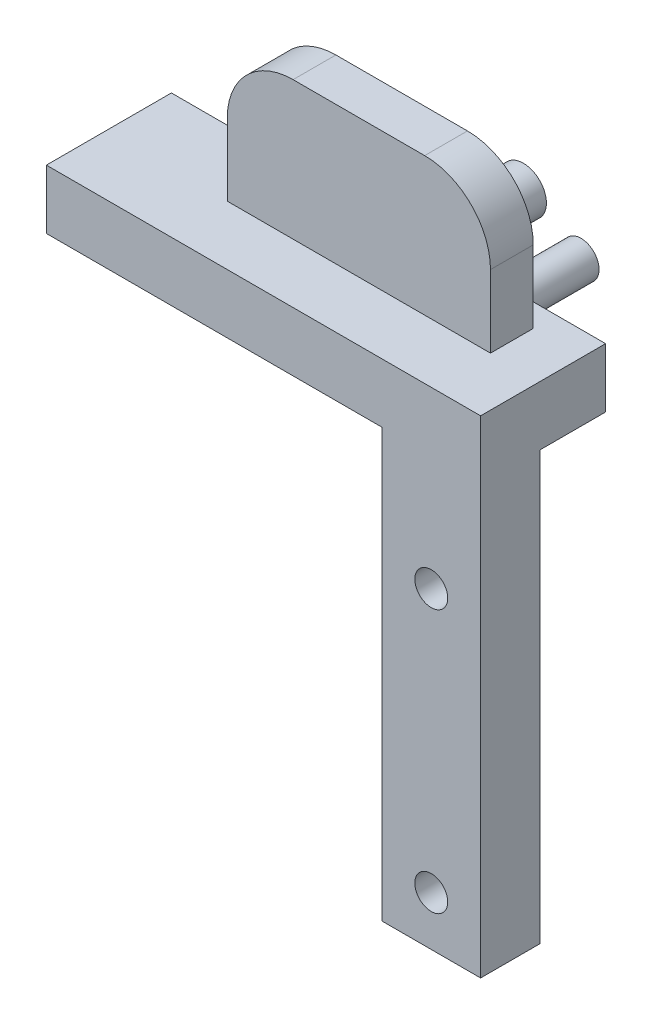
ISO-10303-21;
HEADER;
FILE_DESCRIPTION(('STEP AP214'),'2;1');
FILE_NAME('part.step','',(''),(''),'','','');
FILE_SCHEMA(('AUTOMOTIVE_DESIGN { 1 0 10303 214 1 1 1 1 }'));
ENDSEC;
DATA;
#1=APPLICATION_CONTEXT('core data for automotive mechanical design processes');
#2=APPLICATION_PROTOCOL_DEFINITION('international standard','automotive_design',2000,#1);
#3=PRODUCT_CONTEXT('',#1,'mechanical');
#4=PRODUCT('Part','Part','',(#3));
#5=PRODUCT_RELATED_PRODUCT_CATEGORY('part','',(#4));
#6=PRODUCT_DEFINITION_FORMATION('','',#4);
#7=PRODUCT_DEFINITION_CONTEXT('part definition',#1,'design');
#8=PRODUCT_DEFINITION('design','',#6,#7);
#9=PRODUCT_DEFINITION_SHAPE('','',#8);
#10=(LENGTH_UNIT() NAMED_UNIT(*) SI_UNIT(.MILLI.,.METRE.));
#11=(NAMED_UNIT(*) PLANE_ANGLE_UNIT() SI_UNIT($,.RADIAN.));
#12=(NAMED_UNIT(*) SI_UNIT($,.STERADIAN.) SOLID_ANGLE_UNIT());
#13=UNCERTAINTY_MEASURE_WITH_UNIT(LENGTH_MEASURE(1.E-05),#10,'distance_accuracy_value','');
#14=(GEOMETRIC_REPRESENTATION_CONTEXT(3) GLOBAL_UNCERTAINTY_ASSIGNED_CONTEXT((#13)) GLOBAL_UNIT_ASSIGNED_CONTEXT((#10,
#11,#12)) REPRESENTATION_CONTEXT('',''));
#15=CARTESIAN_POINT('',(0.,0.,0.));
#16=DIRECTION('',(0.,0.,1.));
#17=DIRECTION('',(1.,0.,0.));
#18=AXIS2_PLACEMENT_3D('',#15,#16,#17);
#19=CARTESIAN_POINT('',(0.,8.,0.));
#20=DIRECTION('',(0.,-1.,0.));
#21=DIRECTION('',(0.,0.,-1.));
#22=AXIS2_PLACEMENT_3D('',#19,#20,#21);
#23=PLANE('',#22);
#24=DIRECTION('',(0.,0.,1.));
#25=VECTOR('',#24,1.);
#26=CARTESIAN_POINT('',(-11.,8.,-8.5));
#27=LINE('',#26,#25);
#28=CARTESIAN_POINT('',(-11.,8.,-27.5));
#29=VERTEX_POINT('',#28);
#30=CARTESIAN_POINT('',(-11.,8.,-8.5));
#31=VERTEX_POINT('',#30);
#32=EDGE_CURVE('E229',#29,#31,#27,.T.);
#33=ORIENTED_EDGE('',*,*,#32,.T.);
#34=DIRECTION('',(1.,0.,0.));
#35=VECTOR('',#34,1.);
#36=CARTESIAN_POINT('',(-11.,8.,-8.5));
#37=LINE('',#36,#35);
#38=CARTESIAN_POINT('',(55.,8.,-8.5));
#39=VERTEX_POINT('',#38);
#40=EDGE_CURVE('E234',#31,#39,#37,.T.);
#41=ORIENTED_EDGE('',*,*,#40,.T.);
#42=DIRECTION('',(0.,0.,-1.));
#43=VECTOR('',#42,1.);
#44=CARTESIAN_POINT('',(55.,8.,-8.5));
#45=LINE('',#44,#43);
#46=CARTESIAN_POINT('',(55.,8.,-27.5));
#47=VERTEX_POINT('',#46);
#48=EDGE_CURVE('E150',#39,#47,#45,.T.);
#49=ORIENTED_EDGE('',*,*,#48,.T.);
#50=DIRECTION('',(-1.,0.,0.));
#51=VECTOR('',#50,1.);
#52=CARTESIAN_POINT('',(-11.,8.,-27.5));
#53=LINE('',#52,#51);
#54=EDGE_CURVE('E237',#47,#29,#53,.T.);
#55=ORIENTED_EDGE('',*,*,#54,.T.);
#56=EDGE_LOOP('',(#33,#41,#49,#55));
#57=FACE_BOUND('',#56,.T.);
#58=DIRECTION('',(-1.,0.,0.));
#59=VECTOR('',#58,1.);
#60=CARTESIAN_POINT('',(0.,8.,-24.));
#61=LINE('',#60,#59);
#62=CARTESIAN_POINT('',(47.5,8.,-24.));
#63=VERTEX_POINT('',#62);
#64=CARTESIAN_POINT('',(7.49999999999999,8.,-24.));
#65=VERTEX_POINT('',#64);
#66=EDGE_CURVE('E213',#63,#65,#61,.T.);
#67=ORIENTED_EDGE('',*,*,#66,.F.);
#68=DIRECTION('',(0.,0.,-1.));
#69=VECTOR('',#68,1.);
#70=CARTESIAN_POINT('',(47.5,8.,0.));
#71=LINE('',#70,#69);
#72=CARTESIAN_POINT('',(47.5,8.,-17.5));
#73=VERTEX_POINT('',#72);
#74=EDGE_CURVE('E193',#73,#63,#71,.T.);
#75=ORIENTED_EDGE('',*,*,#74,.F.);
#76=DIRECTION('',(-1.,0.,0.));
#77=VECTOR('',#76,1.);
#78=CARTESIAN_POINT('',(0.,8.,-17.5));
#79=LINE('',#78,#77);
#80=CARTESIAN_POINT('',(7.49999999999999,8.,-17.5));
#81=VERTEX_POINT('',#80);
#82=EDGE_CURVE('E216',#73,#81,#79,.T.);
#83=ORIENTED_EDGE('',*,*,#82,.T.);
#84=DIRECTION('',(0.,0.,-1.));
#85=VECTOR('',#84,1.);
#86=CARTESIAN_POINT('',(7.49999999999999,8.,0.));
#87=LINE('',#86,#85);
#88=EDGE_CURVE('E200',#81,#65,#87,.T.);
#89=ORIENTED_EDGE('',*,*,#88,.T.);
#90=EDGE_LOOP('',(#67,#75,#83,#89));
#91=FACE_BOUND('',#90,.T.);
#92=ADVANCED_FACE('F48',(#57,#91),#23,.F.);
#93=CARTESIAN_POINT('',(0.,23.,-24.));
#94=DIRECTION('',(0.,0.,1.));
#95=DIRECTION('',(1.,0.,0.));
#96=AXIS2_PLACEMENT_3D('',#93,#94,#95);
#97=PLANE('',#96);
#98=CARTESIAN_POINT('',(17.5,17.,-24.));
#99=DIRECTION('',(0.,0.,1.));
#100=DIRECTION('',(1.,0.,0.));
#101=AXIS2_PLACEMENT_3D('',#98,#99,#100);
#102=CIRCLE('',#101,3.5);
#103=CARTESIAN_POINT('',(21.,17.,-24.));
#104=VERTEX_POINT('',#103);
#105=EDGE_CURVE('E256',#104,#104,#102,.F.);
#106=ORIENTED_EDGE('',*,*,#105,.F.);
#107=EDGE_LOOP('',(#106));
#108=FACE_BOUND('',#107,.T.);
#109=CARTESIAN_POINT('',(37.5,17.,-24.));
#110=DIRECTION('',(0.,0.,1.));
#111=DIRECTION('',(1.,0.,0.));
#112=AXIS2_PLACEMENT_3D('',#109,#110,#111);
#113=CIRCLE('',#112,3.5);
#114=CARTESIAN_POINT('',(41.,17.,-24.));
#115=VERTEX_POINT('',#114);
#116=EDGE_CURVE('E251',#115,#115,#113,.F.);
#117=ORIENTED_EDGE('',*,*,#116,.F.);
#118=EDGE_LOOP('',(#117));
#119=FACE_BOUND('',#118,.T.);
#120=DIRECTION('',(-1.,0.,0.));
#121=VECTOR('',#120,1.);
#122=CARTESIAN_POINT('',(32.,29.,-24.));
#123=LINE('',#122,#121);
#124=CARTESIAN_POINT('',(37.5,29.,-24.));
#125=VERTEX_POINT('',#124);
#126=CARTESIAN_POINT('',(17.5,29.,-24.));
#127=VERTEX_POINT('',#126);
#128=EDGE_CURVE('E207',#125,#127,#123,.T.);
#129=ORIENTED_EDGE('',*,*,#128,.F.);
#130=CARTESIAN_POINT('',(37.5,19.,-24.));
#131=DIRECTION('',(0.,0.,1.));
#132=DIRECTION('',(1.,0.,0.));
#133=AXIS2_PLACEMENT_3D('',#130,#131,#132);
#134=CIRCLE('',#133,10.);
#135=CARTESIAN_POINT('',(47.5,19.,-24.));
#136=VERTEX_POINT('',#135);
#137=EDGE_CURVE('E266',#125,#136,#134,.F.);
#138=ORIENTED_EDGE('',*,*,#137,.T.);
#139=DIRECTION('',(0.,-1.,0.));
#140=VECTOR('',#139,1.);
#141=CARTESIAN_POINT('',(47.5,29.,-24.));
#142=LINE('',#141,#140);
#143=EDGE_CURVE('E198',#136,#63,#142,.T.);
#144=ORIENTED_EDGE('',*,*,#143,.T.);
#145=ORIENTED_EDGE('',*,*,#66,.T.);
#146=DIRECTION('',(0.,-1.,0.));
#147=VECTOR('',#146,1.);
#148=CARTESIAN_POINT('',(7.49999999999999,29.,-24.));
#149=LINE('',#148,#147);
#150=CARTESIAN_POINT('',(7.49999999999999,19.,-24.));
#151=VERTEX_POINT('',#150);
#152=EDGE_CURVE('E203',#151,#65,#149,.T.);
#153=ORIENTED_EDGE('',*,*,#152,.F.);
#154=CARTESIAN_POINT('',(17.5,19.,-24.));
#155=DIRECTION('',(0.,0.,1.));
#156=DIRECTION('',(1.,0.,0.));
#157=AXIS2_PLACEMENT_3D('',#154,#155,#156);
#158=CIRCLE('',#157,10.);
#159=EDGE_CURVE('E264',#151,#127,#158,.F.);
#160=ORIENTED_EDGE('',*,*,#159,.T.);
#161=EDGE_LOOP('',(#129,#138,#144,#145,#153,#160));
#162=FACE_BOUND('',#161,.T.);
#163=ADVANCED_FACE('F288',(#108,#119,#162),#97,.F.);
#164=CARTESIAN_POINT('',(-11.,-1.,-8.5));
#165=DIRECTION('',(-1.,0.,0.));
#166=DIRECTION('',(0.,0.,1.));
#167=AXIS2_PLACEMENT_3D('',#164,#165,#166);
#168=PLANE('',#167);
#169=DIRECTION('',(0.,1.,0.));
#170=VECTOR('',#169,1.);
#171=CARTESIAN_POINT('',(-11.,-1.,-8.5));
#172=LINE('',#171,#170);
#173=CARTESIAN_POINT('',(-11.,-1.,-8.5));
#174=VERTEX_POINT('',#173);
#175=EDGE_CURVE('E155',#174,#31,#172,.T.);
#176=ORIENTED_EDGE('',*,*,#175,.T.);
#177=ORIENTED_EDGE('',*,*,#32,.F.);
#178=DIRECTION('',(0.,1.,0.));
#179=VECTOR('',#178,1.);
#180=CARTESIAN_POINT('',(-11.,-1.,-27.5));
#181=LINE('',#180,#179);
#182=CARTESIAN_POINT('',(-11.,-1.,-27.5));
#183=VERTEX_POINT('',#182);
#184=EDGE_CURVE('E249',#183,#29,#181,.T.);
#185=ORIENTED_EDGE('',*,*,#184,.F.);
#186=DIRECTION('',(0.,0.,1.));
#187=VECTOR('',#186,1.);
#188=CARTESIAN_POINT('',(-11.,-1.,-8.5));
#189=LINE('',#188,#187);
#190=EDGE_CURVE('E240',#183,#174,#189,.T.);
#191=ORIENTED_EDGE('',*,*,#190,.T.);
#192=EDGE_LOOP('',(#176,#177,#185,#191));
#193=FACE_BOUND('',#192,.T.);
#194=ADVANCED_FACE('F317',(#193),#168,.T.);
#195=CARTESIAN_POINT('',(-11.,-1.,-27.5));
#196=DIRECTION('',(0.,0.,-1.));
#197=DIRECTION('',(-1.,0.,0.));
#198=AXIS2_PLACEMENT_3D('',#195,#196,#197);
#199=PLANE('',#198);
#200=CARTESIAN_POINT('',(17.5,3.5,-27.5));
#201=DIRECTION('',(0.,0.,-1.));
#202=DIRECTION('',(-1.,0.,0.));
#203=AXIS2_PLACEMENT_3D('',#200,#201,#202);
#204=CIRCLE('',#203,2.75);
#205=CARTESIAN_POINT('',(14.75,3.5,-27.5));
#206=VERTEX_POINT('',#205);
#207=EDGE_CURVE('E219',#206,#206,#204,.T.);
#208=ORIENTED_EDGE('',*,*,#207,.F.);
#209=EDGE_LOOP('',(#208));
#210=FACE_BOUND('',#209,.T.);
#211=CARTESIAN_POINT('',(37.5,3.5,-27.5));
#212=DIRECTION('',(0.,0.,-1.));
#213=DIRECTION('',(-1.,0.,0.));
#214=AXIS2_PLACEMENT_3D('',#211,#212,#213);
#215=CIRCLE('',#214,2.75);
#216=CARTESIAN_POINT('',(34.75,3.5,-27.5));
#217=VERTEX_POINT('',#216);
#218=EDGE_CURVE('E223',#217,#217,#215,.T.);
#219=ORIENTED_EDGE('',*,*,#218,.F.);
#220=EDGE_LOOP('',(#219));
#221=FACE_BOUND('',#220,.T.);
#222=ORIENTED_EDGE('',*,*,#184,.T.);
#223=ORIENTED_EDGE('',*,*,#54,.F.);
#224=DIRECTION('',(0.,1.,0.));
#225=VECTOR('',#224,1.);
#226=CARTESIAN_POINT('',(55.,-1.,-27.5));
#227=LINE('',#226,#225);
#228=CARTESIAN_POINT('',(55.,-1.,-27.5));
#229=VERTEX_POINT('',#228);
#230=EDGE_CURVE('E154',#229,#47,#227,.T.);
#231=ORIENTED_EDGE('',*,*,#230,.F.);
#232=DIRECTION('',(-1.,0.,0.));
#233=VECTOR('',#232,1.);
#234=CARTESIAN_POINT('',(-11.,-1.,-27.5));
#235=LINE('',#234,#233);
#236=EDGE_CURVE('E246',#229,#183,#235,.T.);
#237=ORIENTED_EDGE('',*,*,#236,.T.);
#238=EDGE_LOOP('',(#222,#223,#231,#237));
#239=FACE_BOUND('',#238,.T.);
#240=ADVANCED_FACE('F327',(#210,#221,#239),#199,.T.);
#241=CARTESIAN_POINT('',(55.,-1.,-8.5));
#242=DIRECTION('',(1.,0.,0.));
#243=DIRECTION('',(0.,0.,-1.));
#244=AXIS2_PLACEMENT_3D('',#241,#242,#243);
#245=PLANE('',#244);
#246=ORIENTED_EDGE('',*,*,#230,.T.);
#247=ORIENTED_EDGE('',*,*,#48,.F.);
#248=DIRECTION('',(0.,1.,0.));
#249=VECTOR('',#248,1.);
#250=CARTESIAN_POINT('',(55.,-1.,-8.5));
#251=LINE('',#250,#249);
#252=CARTESIAN_POINT('',(55.,-66.,-8.49999999999999));
#253=VERTEX_POINT('',#252);
#254=EDGE_CURVE('E143',#253,#39,#251,.T.);
#255=ORIENTED_EDGE('',*,*,#254,.F.);
#256=DIRECTION('',(0.,0.,1.));
#257=VECTOR('',#256,1.);
#258=CARTESIAN_POINT('',(55.,-66.,-17.5));
#259=LINE('',#258,#257);
#260=CARTESIAN_POINT('',(55.,-66.,-17.5));
#261=VERTEX_POINT('',#260);
#262=EDGE_CURVE('E148',#261,#253,#259,.T.);
#263=ORIENTED_EDGE('',*,*,#262,.F.);
#264=DIRECTION('',(0.,1.,0.));
#265=VECTOR('',#264,1.);
#266=CARTESIAN_POINT('',(55.,-66.,-17.5));
#267=LINE('',#266,#265);
#268=CARTESIAN_POINT('',(55.,-1.,-17.5));
#269=VERTEX_POINT('',#268);
#270=EDGE_CURVE('E179',#261,#269,#267,.T.);
#271=ORIENTED_EDGE('',*,*,#270,.T.);
#272=DIRECTION('',(0.,0.,-1.));
#273=VECTOR('',#272,1.);
#274=CARTESIAN_POINT('',(55.,-1.,-8.5));
#275=LINE('',#274,#273);
#276=EDGE_CURVE('E69',#269,#229,#275,.T.);
#277=ORIENTED_EDGE('',*,*,#276,.T.);
#278=EDGE_LOOP('',(#246,#247,#255,#263,#271,#277));
#279=FACE_BOUND('',#278,.T.);
#280=ADVANCED_FACE('F145',(#279),#245,.T.);
#281=CARTESIAN_POINT('',(-11.,-1.,-8.5));
#282=DIRECTION('',(0.,0.,1.));
#283=DIRECTION('',(1.,0.,0.));
#284=AXIS2_PLACEMENT_3D('',#281,#282,#283);
#285=PLANE('',#284);
#286=CARTESIAN_POINT('',(47.5,-18.5,-8.5));
#287=DIRECTION('',(0.,0.,1.));
#288=DIRECTION('',(1.,0.,0.));
#289=AXIS2_PLACEMENT_3D('',#286,#287,#288);
#290=CIRCLE('',#289,2.5);
#291=CARTESIAN_POINT('',(50.,-18.5,-8.5));
#292=VERTEX_POINT('',#291);
#293=EDGE_CURVE('E611',#292,#292,#290,.F.);
#294=ORIENTED_EDGE('',*,*,#293,.T.);
#295=EDGE_LOOP('',(#294));
#296=FACE_BOUND('',#295,.T.);
#297=CARTESIAN_POINT('',(47.5,-58.5,-8.5));
#298=DIRECTION('',(0.,0.,1.));
#299=DIRECTION('',(1.,0.,0.));
#300=AXIS2_PLACEMENT_3D('',#297,#298,#299);
#301=CIRCLE('',#300,2.5);
#302=CARTESIAN_POINT('',(50.,-58.5,-8.5));
#303=VERTEX_POINT('',#302);
#304=EDGE_CURVE('E174',#303,#303,#301,.F.);
#305=ORIENTED_EDGE('',*,*,#304,.T.);
#306=EDGE_LOOP('',(#305));
#307=FACE_BOUND('',#306,.T.);
#308=ORIENTED_EDGE('',*,*,#254,.T.);
#309=ORIENTED_EDGE('',*,*,#40,.F.);
#310=ORIENTED_EDGE('',*,*,#175,.F.);
#311=DIRECTION('',(1.,0.,0.));
#312=VECTOR('',#311,1.);
#313=CARTESIAN_POINT('',(-11.,-1.,-8.5));
#314=LINE('',#313,#312);
#315=CARTESIAN_POINT('',(40.,-1.,-8.5));
#316=VERTEX_POINT('',#315);
#317=EDGE_CURVE('E243',#174,#316,#314,.T.);
#318=ORIENTED_EDGE('',*,*,#317,.T.);
#319=DIRECTION('',(0.,1.,0.));
#320=VECTOR('',#319,1.);
#321=CARTESIAN_POINT('',(40.,-66.,-8.49999999999999));
#322=LINE('',#321,#320);
#323=CARTESIAN_POINT('',(40.,-66.,-8.49999999999999));
#324=VERTEX_POINT('',#323);
#325=EDGE_CURVE('E161',#324,#316,#322,.T.);
#326=ORIENTED_EDGE('',*,*,#325,.F.);
#327=DIRECTION('',(-1.,0.,0.));
#328=VECTOR('',#327,1.);
#329=CARTESIAN_POINT('',(55.,-66.,-8.49999999999999));
#330=LINE('',#329,#328);
#331=EDGE_CURVE('E158',#253,#324,#330,.T.);
#332=ORIENTED_EDGE('',*,*,#331,.F.);
#333=EDGE_LOOP('',(#308,#309,#310,#318,#326,#332));
#334=FACE_BOUND('',#333,.T.);
#335=ADVANCED_FACE('F159',(#296,#307,#334),#285,.T.);
#336=CARTESIAN_POINT('',(0.,-1.,0.));
#337=DIRECTION('',(0.,-1.,0.));
#338=DIRECTION('',(0.,0.,-1.));
#339=AXIS2_PLACEMENT_3D('',#336,#337,#338);
#340=PLANE('',#339);
#341=DIRECTION('',(1.,0.,0.));
#342=VECTOR('',#341,1.);
#343=CARTESIAN_POINT('',(55.,-1.,-17.5));
#344=LINE('',#343,#342);
#345=CARTESIAN_POINT('',(40.,-1.,-17.5));
#346=VERTEX_POINT('',#345);
#347=EDGE_CURVE('E170',#346,#269,#344,.T.);
#348=ORIENTED_EDGE('',*,*,#347,.F.);
#349=DIRECTION('',(0.,0.,-1.));
#350=VECTOR('',#349,1.);
#351=CARTESIAN_POINT('',(40.,-1.,-17.5));
#352=LINE('',#351,#350);
#353=EDGE_CURVE('E63',#316,#346,#352,.T.);
#354=ORIENTED_EDGE('',*,*,#353,.F.);
#355=ORIENTED_EDGE('',*,*,#317,.F.);
#356=ORIENTED_EDGE('',*,*,#190,.F.);
#357=ORIENTED_EDGE('',*,*,#236,.F.);
#358=ORIENTED_EDGE('',*,*,#276,.F.);
#359=EDGE_LOOP('',(#348,#354,#355,#356,#357,#358));
#360=FACE_BOUND('',#359,.T.);
#361=ADVANCED_FACE('F324',(#360),#340,.T.);
#362=CARTESIAN_POINT('',(37.5,3.5,-41.25));
#363=DIRECTION('',(0.,0.,1.));
#364=DIRECTION('',(1.,0.,0.));
#365=AXIS2_PLACEMENT_3D('',#362,#363,#364);
#366=CYLINDRICAL_SURFACE('',#365,2.75);
#367=CARTESIAN_POINT('',(37.5,3.5,-41.25));
#368=DIRECTION('',(0.,0.,-1.));
#369=DIRECTION('',(-1.,0.,0.));
#370=AXIS2_PLACEMENT_3D('',#367,#368,#369);
#371=CIRCLE('',#370,2.75);
#372=CARTESIAN_POINT('',(34.75,3.5,-41.25));
#373=VERTEX_POINT('',#372);
#374=EDGE_CURVE('E226',#373,#373,#371,.T.);
#375=ORIENTED_EDGE('',*,*,#374,.F.);
#376=EDGE_LOOP('',(#375));
#377=FACE_BOUND('',#376,.T.);
#378=ORIENTED_EDGE('',*,*,#218,.T.);
#379=EDGE_LOOP('',(#378));
#380=FACE_BOUND('',#379,.T.);
#381=ADVANCED_FACE('F322',(#377,#380),#366,.T.);
#382=CARTESIAN_POINT('',(37.5,3.5,-41.25));
#383=DIRECTION('',(0.,0.,-1.));
#384=DIRECTION('',(-1.,0.,0.));
#385=AXIS2_PLACEMENT_3D('',#382,#383,#384);
#386=PLANE('',#385);
#387=ORIENTED_EDGE('',*,*,#374,.T.);
#388=EDGE_LOOP('',(#387));
#389=FACE_BOUND('',#388,.T.);
#390=ADVANCED_FACE('F388',(#389),#386,.T.);
#391=CARTESIAN_POINT('',(17.5,3.5,-41.25));
#392=DIRECTION('',(0.,0.,1.));
#393=DIRECTION('',(1.,0.,0.));
#394=AXIS2_PLACEMENT_3D('',#391,#392,#393);
#395=CYLINDRICAL_SURFACE('',#394,2.75);
#396=CARTESIAN_POINT('',(17.5,3.5,-41.25));
#397=DIRECTION('',(0.,0.,-1.));
#398=DIRECTION('',(-1.,0.,0.));
#399=AXIS2_PLACEMENT_3D('',#396,#397,#398);
#400=CIRCLE('',#399,2.75);
#401=CARTESIAN_POINT('',(14.75,3.5,-41.25));
#402=VERTEX_POINT('',#401);
#403=EDGE_CURVE('E220',#402,#402,#400,.T.);
#404=ORIENTED_EDGE('',*,*,#403,.F.);
#405=EDGE_LOOP('',(#404));
#406=FACE_BOUND('',#405,.T.);
#407=ORIENTED_EDGE('',*,*,#207,.T.);
#408=EDGE_LOOP('',(#407));
#409=FACE_BOUND('',#408,.T.);
#410=ADVANCED_FACE('F385',(#406,#409),#395,.T.);
#411=CARTESIAN_POINT('',(17.5,3.5,-41.25));
#412=DIRECTION('',(0.,0.,-1.));
#413=DIRECTION('',(-1.,0.,0.));
#414=AXIS2_PLACEMENT_3D('',#411,#412,#413);
#415=PLANE('',#414);
#416=ORIENTED_EDGE('',*,*,#403,.T.);
#417=EDGE_LOOP('',(#416));
#418=FACE_BOUND('',#417,.T.);
#419=ADVANCED_FACE('F381',(#418),#415,.T.);
#420=CARTESIAN_POINT('',(0.,23.,-17.5));
#421=DIRECTION('',(0.,0.,1.));
#422=DIRECTION('',(1.,0.,0.));
#423=AXIS2_PLACEMENT_3D('',#420,#421,#422);
#424=PLANE('',#423);
#425=DIRECTION('',(0.,-1.,0.));
#426=VECTOR('',#425,1.);
#427=CARTESIAN_POINT('',(47.5,29.,-17.5));
#428=LINE('',#427,#426);
#429=CARTESIAN_POINT('',(47.5,19.,-17.5));
#430=VERTEX_POINT('',#429);
#431=EDGE_CURVE('E196',#430,#73,#428,.T.);
#432=ORIENTED_EDGE('',*,*,#431,.F.);
#433=CARTESIAN_POINT('',(37.5,19.,-17.5));
#434=DIRECTION('',(0.,0.,1.));
#435=DIRECTION('',(1.,0.,0.));
#436=AXIS2_PLACEMENT_3D('',#433,#434,#435);
#437=CIRCLE('',#436,10.);
#438=CARTESIAN_POINT('',(37.5,29.,-17.5));
#439=VERTEX_POINT('',#438);
#440=EDGE_CURVE('E56',#430,#439,#437,.T.);
#441=ORIENTED_EDGE('',*,*,#440,.T.);
#442=DIRECTION('',(1.,0.,0.));
#443=VECTOR('',#442,1.);
#444=CARTESIAN_POINT('',(32.,29.,-17.5));
#445=LINE('',#444,#443);
#446=CARTESIAN_POINT('',(17.5,29.,-17.5));
#447=VERTEX_POINT('',#446);
#448=EDGE_CURVE('E210',#447,#439,#445,.T.);
#449=ORIENTED_EDGE('',*,*,#448,.F.);
#450=CARTESIAN_POINT('',(17.5,19.,-17.5));
#451=DIRECTION('',(0.,0.,1.));
#452=DIRECTION('',(1.,0.,0.));
#453=AXIS2_PLACEMENT_3D('',#450,#451,#452);
#454=CIRCLE('',#453,10.);
#455=CARTESIAN_POINT('',(7.49999999999999,19.,-17.5));
#456=VERTEX_POINT('',#455);
#457=EDGE_CURVE('E270',#447,#456,#454,.T.);
#458=ORIENTED_EDGE('',*,*,#457,.T.);
#459=DIRECTION('',(0.,-1.,0.));
#460=VECTOR('',#459,1.);
#461=CARTESIAN_POINT('',(7.49999999999999,29.,-17.5));
#462=LINE('',#461,#460);
#463=EDGE_CURVE('E205',#456,#81,#462,.T.);
#464=ORIENTED_EDGE('',*,*,#463,.T.);
#465=ORIENTED_EDGE('',*,*,#82,.F.);
#466=EDGE_LOOP('',(#432,#441,#449,#458,#464,#465));
#467=FACE_BOUND('',#466,.T.);
#468=ADVANCED_FACE('F275',(#467),#424,.T.);
#469=CARTESIAN_POINT('',(0.,29.,0.));
#470=DIRECTION('',(0.,-1.,0.));
#471=DIRECTION('',(0.,0.,-1.));
#472=AXIS2_PLACEMENT_3D('',#469,#470,#471);
#473=PLANE('',#472);
#474=ORIENTED_EDGE('',*,*,#448,.T.);
#475=DIRECTION('',(0.,0.,-1.));
#476=VECTOR('',#475,1.);
#477=CARTESIAN_POINT('',(37.5,29.,0.));
#478=LINE('',#477,#476);
#479=EDGE_CURVE('E261',#439,#125,#478,.T.);
#480=ORIENTED_EDGE('',*,*,#479,.T.);
#481=ORIENTED_EDGE('',*,*,#128,.T.);
#482=DIRECTION('',(0.,0.,-1.));
#483=VECTOR('',#482,1.);
#484=CARTESIAN_POINT('',(17.5,29.,-17.5));
#485=LINE('',#484,#483);
#486=EDGE_CURVE('E259',#127,#447,#485,.F.);
#487=ORIENTED_EDGE('',*,*,#486,.T.);
#488=EDGE_LOOP('',(#474,#480,#481,#487));
#489=FACE_BOUND('',#488,.T.);
#490=ADVANCED_FACE('F282',(#489),#473,.F.);
#491=CARTESIAN_POINT('',(7.49999999999999,29.,0.));
#492=DIRECTION('',(-1.,0.,0.));
#493=DIRECTION('',(0.,0.,1.));
#494=AXIS2_PLACEMENT_3D('',#491,#492,#493);
#495=PLANE('',#494);
#496=ORIENTED_EDGE('',*,*,#463,.F.);
#497=DIRECTION('',(0.,0.,-1.));
#498=VECTOR('',#497,1.);
#499=CARTESIAN_POINT('',(7.49999999999999,19.,-24.));
#500=LINE('',#499,#498);
#501=EDGE_CURVE('E12',#456,#151,#500,.T.);
#502=ORIENTED_EDGE('',*,*,#501,.T.);
#503=ORIENTED_EDGE('',*,*,#152,.T.);
#504=ORIENTED_EDGE('',*,*,#88,.F.);
#505=EDGE_LOOP('',(#496,#502,#503,#504));
#506=FACE_BOUND('',#505,.T.);
#507=ADVANCED_FACE('F298',(#506),#495,.T.);
#508=CARTESIAN_POINT('',(47.5,29.,0.));
#509=DIRECTION('',(-1.,0.,0.));
#510=DIRECTION('',(0.,0.,1.));
#511=AXIS2_PLACEMENT_3D('',#508,#509,#510);
#512=PLANE('',#511);
#513=ORIENTED_EDGE('',*,*,#143,.F.);
#514=DIRECTION('',(0.,0.,-1.));
#515=VECTOR('',#514,1.);
#516=CARTESIAN_POINT('',(47.5,19.,0.));
#517=LINE('',#516,#515);
#518=EDGE_CURVE('E268',#136,#430,#517,.F.);
#519=ORIENTED_EDGE('',*,*,#518,.T.);
#520=ORIENTED_EDGE('',*,*,#431,.T.);
#521=ORIENTED_EDGE('',*,*,#74,.T.);
#522=EDGE_LOOP('',(#513,#519,#520,#521));
#523=FACE_BOUND('',#522,.T.);
#524=ADVANCED_FACE('F291',(#523),#512,.F.);
#525=CARTESIAN_POINT('',(37.5,17.,-32.5));
#526=DIRECTION('',(0.,0.,1.));
#527=DIRECTION('',(1.,0.,0.));
#528=AXIS2_PLACEMENT_3D('',#525,#526,#527);
#529=CYLINDRICAL_SURFACE('',#528,3.5);
#530=CARTESIAN_POINT('',(37.5,17.,-32.5));
#531=DIRECTION('',(0.,0.,-1.));
#532=DIRECTION('',(-1.,0.,0.));
#533=AXIS2_PLACEMENT_3D('',#530,#531,#532);
#534=CIRCLE('',#533,3.5);
#535=CARTESIAN_POINT('',(34.,17.,-32.5));
#536=VERTEX_POINT('',#535);
#537=EDGE_CURVE('E190',#536,#536,#534,.T.);
#538=ORIENTED_EDGE('',*,*,#537,.F.);
#539=EDGE_LOOP('',(#538));
#540=FACE_BOUND('',#539,.T.);
#541=ORIENTED_EDGE('',*,*,#116,.T.);
#542=EDGE_LOOP('',(#541));
#543=FACE_BOUND('',#542,.T.);
#544=ADVANCED_FACE('F369',(#540,#543),#529,.T.);
#545=CARTESIAN_POINT('',(0.,0.,-32.5));
#546=DIRECTION('',(0.,0.,-1.));
#547=DIRECTION('',(-1.,0.,0.));
#548=AXIS2_PLACEMENT_3D('',#545,#546,#547);
#549=PLANE('',#548);
#550=ORIENTED_EDGE('',*,*,#537,.T.);
#551=EDGE_LOOP('',(#550));
#552=FACE_BOUND('',#551,.T.);
#553=ADVANCED_FACE('F362',(#552),#549,.T.);
#554=CARTESIAN_POINT('',(17.5,17.,-32.5));
#555=DIRECTION('',(0.,0.,1.));
#556=DIRECTION('',(1.,0.,0.));
#557=AXIS2_PLACEMENT_3D('',#554,#555,#556);
#558=CYLINDRICAL_SURFACE('',#557,3.5);
#559=ORIENTED_EDGE('',*,*,#105,.T.);
#560=EDGE_LOOP('',(#559));
#561=FACE_BOUND('',#560,.T.);
#562=CARTESIAN_POINT('',(17.5,17.,-32.5));
#563=DIRECTION('',(0.,0.,-1.));
#564=DIRECTION('',(-1.,0.,0.));
#565=AXIS2_PLACEMENT_3D('',#562,#563,#564);
#566=CIRCLE('',#565,3.5);
#567=CARTESIAN_POINT('',(14.,17.,-32.5));
#568=VERTEX_POINT('',#567);
#569=EDGE_CURVE('E187',#568,#568,#566,.T.);
#570=ORIENTED_EDGE('',*,*,#569,.F.);
#571=EDGE_LOOP('',(#570));
#572=FACE_BOUND('',#571,.T.);
#573=ADVANCED_FACE('F359',(#561,#572),#558,.T.);
#574=CARTESIAN_POINT('',(0.,0.,-32.5));
#575=DIRECTION('',(0.,0.,-1.));
#576=DIRECTION('',(-1.,0.,0.));
#577=AXIS2_PLACEMENT_3D('',#574,#575,#576);
#578=PLANE('',#577);
#579=ORIENTED_EDGE('',*,*,#569,.T.);
#580=EDGE_LOOP('',(#579));
#581=FACE_BOUND('',#580,.T.);
#582=ADVANCED_FACE('F310',(#581),#578,.T.);
#583=CARTESIAN_POINT('',(37.5,19.,0.));
#584=DIRECTION('',(0.,0.,-1.));
#585=DIRECTION('',(-1.,0.,0.));
#586=AXIS2_PLACEMENT_3D('',#583,#584,#585);
#587=CYLINDRICAL_SURFACE('',#586,10.);
#588=ORIENTED_EDGE('',*,*,#440,.F.);
#589=ORIENTED_EDGE('',*,*,#518,.F.);
#590=ORIENTED_EDGE('',*,*,#137,.F.);
#591=ORIENTED_EDGE('',*,*,#479,.F.);
#592=EDGE_LOOP('',(#588,#589,#590,#591));
#593=FACE_BOUND('',#592,.T.);
#594=ADVANCED_FACE('F285',(#593),#587,.T.);
#595=CARTESIAN_POINT('',(17.5,19.,0.));
#596=DIRECTION('',(0.,0.,1.));
#597=DIRECTION('',(1.,0.,0.));
#598=AXIS2_PLACEMENT_3D('',#595,#596,#597);
#599=CYLINDRICAL_SURFACE('',#598,10.);
#600=ORIENTED_EDGE('',*,*,#457,.F.);
#601=ORIENTED_EDGE('',*,*,#486,.F.);
#602=ORIENTED_EDGE('',*,*,#159,.F.);
#603=ORIENTED_EDGE('',*,*,#501,.F.);
#604=EDGE_LOOP('',(#600,#601,#602,#603));
#605=FACE_BOUND('',#604,.T.);
#606=ADVANCED_FACE('F50',(#605),#599,.T.);
#607=CARTESIAN_POINT('',(40.,-66.,-17.5));
#608=DIRECTION('',(1.,0.,0.));
#609=DIRECTION('',(0.,0.,-1.));
#610=AXIS2_PLACEMENT_3D('',#607,#608,#609);
#611=PLANE('',#610);
#612=ORIENTED_EDGE('',*,*,#353,.T.);
#613=DIRECTION('',(0.,1.,0.));
#614=VECTOR('',#613,1.);
#615=CARTESIAN_POINT('',(40.,-66.,-17.5));
#616=LINE('',#615,#614);
#617=CARTESIAN_POINT('',(40.,-66.,-17.5));
#618=VERTEX_POINT('',#617);
#619=EDGE_CURVE('E183',#618,#346,#616,.T.);
#620=ORIENTED_EDGE('',*,*,#619,.F.);
#621=DIRECTION('',(0.,0.,-1.));
#622=VECTOR('',#621,1.);
#623=CARTESIAN_POINT('',(40.,-66.,-17.5));
#624=LINE('',#623,#622);
#625=EDGE_CURVE('E164',#324,#618,#624,.T.);
#626=ORIENTED_EDGE('',*,*,#625,.F.);
#627=ORIENTED_EDGE('',*,*,#325,.T.);
#628=EDGE_LOOP('',(#612,#620,#626,#627));
#629=FACE_BOUND('',#628,.T.);
#630=ADVANCED_FACE('F302',(#629),#611,.F.);
#631=CARTESIAN_POINT('',(55.,-66.,-17.5));
#632=DIRECTION('',(0.,0.,1.));
#633=DIRECTION('',(1.,0.,0.));
#634=AXIS2_PLACEMENT_3D('',#631,#632,#633);
#635=PLANE('',#634);
#636=CARTESIAN_POINT('',(47.5,-18.5,-17.5));
#637=DIRECTION('',(0.,0.,-1.));
#638=DIRECTION('',(-1.,0.,0.));
#639=AXIS2_PLACEMENT_3D('',#636,#637,#638);
#640=CIRCLE('',#639,2.5);
#641=CARTESIAN_POINT('',(45.,-18.5,-17.5));
#642=VERTEX_POINT('',#641);
#643=EDGE_CURVE('E613',#642,#642,#640,.T.);
#644=ORIENTED_EDGE('',*,*,#643,.F.);
#645=EDGE_LOOP('',(#644));
#646=FACE_BOUND('',#645,.T.);
#647=CARTESIAN_POINT('',(47.5,-58.5,-17.5));
#648=DIRECTION('',(0.,0.,-1.));
#649=DIRECTION('',(-1.,0.,0.));
#650=AXIS2_PLACEMENT_3D('',#647,#648,#649);
#651=CIRCLE('',#650,2.5);
#652=CARTESIAN_POINT('',(45.,-58.5,-17.5));
#653=VERTEX_POINT('',#652);
#654=EDGE_CURVE('E180',#653,#653,#651,.T.);
#655=ORIENTED_EDGE('',*,*,#654,.F.);
#656=EDGE_LOOP('',(#655));
#657=FACE_BOUND('',#656,.T.);
#658=ORIENTED_EDGE('',*,*,#347,.T.);
#659=ORIENTED_EDGE('',*,*,#270,.F.);
#660=DIRECTION('',(1.,0.,0.));
#661=VECTOR('',#660,1.);
#662=CARTESIAN_POINT('',(55.,-66.,-17.5));
#663=LINE('',#662,#661);
#664=EDGE_CURVE('E168',#618,#261,#663,.T.);
#665=ORIENTED_EDGE('',*,*,#664,.F.);
#666=ORIENTED_EDGE('',*,*,#619,.T.);
#667=EDGE_LOOP('',(#658,#659,#665,#666));
#668=FACE_BOUND('',#667,.T.);
#669=ADVANCED_FACE('F307',(#646,#657,#668),#635,.F.);
#670=CARTESIAN_POINT('',(0.,-66.,0.));
#671=DIRECTION('',(0.,-1.,0.));
#672=DIRECTION('',(0.,0.,-1.));
#673=AXIS2_PLACEMENT_3D('',#670,#671,#672);
#674=PLANE('',#673);
#675=ORIENTED_EDGE('',*,*,#262,.T.);
#676=ORIENTED_EDGE('',*,*,#331,.T.);
#677=ORIENTED_EDGE('',*,*,#625,.T.);
#678=ORIENTED_EDGE('',*,*,#664,.T.);
#679=EDGE_LOOP('',(#675,#676,#677,#678));
#680=FACE_BOUND('',#679,.T.);
#681=ADVANCED_FACE('F166',(#680),#674,.T.);
#682=CARTESIAN_POINT('',(47.5,-58.5,-8.49899999999999));
#683=DIRECTION('',(0.,0.,-1.));
#684=DIRECTION('',(-1.,0.,0.));
#685=AXIS2_PLACEMENT_3D('',#682,#683,#684);
#686=CYLINDRICAL_SURFACE('',#685,2.5);
#687=ORIENTED_EDGE('',*,*,#304,.F.);
#688=EDGE_LOOP('',(#687));
#689=FACE_BOUND('',#688,.T.);
#690=ORIENTED_EDGE('',*,*,#654,.T.);
#691=EDGE_LOOP('',(#690));
#692=FACE_BOUND('',#691,.T.);
#693=ADVANCED_FACE('F353',(#689,#692),#686,.F.);
#694=CARTESIAN_POINT('',(47.5,-18.5,-8.49899999999999));
#695=DIRECTION('',(0.,0.,-1.));
#696=DIRECTION('',(-1.,0.,0.));
#697=AXIS2_PLACEMENT_3D('',#694,#695,#696);
#698=CYLINDRICAL_SURFACE('',#697,2.5);
#699=ORIENTED_EDGE('',*,*,#293,.F.);
#700=EDGE_LOOP('',(#699));
#701=FACE_BOUND('',#700,.T.);
#702=ORIENTED_EDGE('',*,*,#643,.T.);
#703=EDGE_LOOP('',(#702));
#704=FACE_BOUND('',#703,.T.);
#705=ADVANCED_FACE('F595',(#701,#704),#698,.F.);
#706=CLOSED_SHELL('',(#92,#163,#194,#240,#280,#335,#361,#381,#390,#410,#419,#468,#490,#507,#524,
#544,#553,#573,#582,#594,#606,#630,#669,#681,#693,#705));
#707=MANIFOLD_SOLID_BREP('B2',#706);
#708=ADVANCED_BREP_SHAPE_REPRESENTATION('',(#18,#707),#14);
#709=SHAPE_DEFINITION_REPRESENTATION(#9,#708);
ENDSEC;
END-ISO-10303-21;
